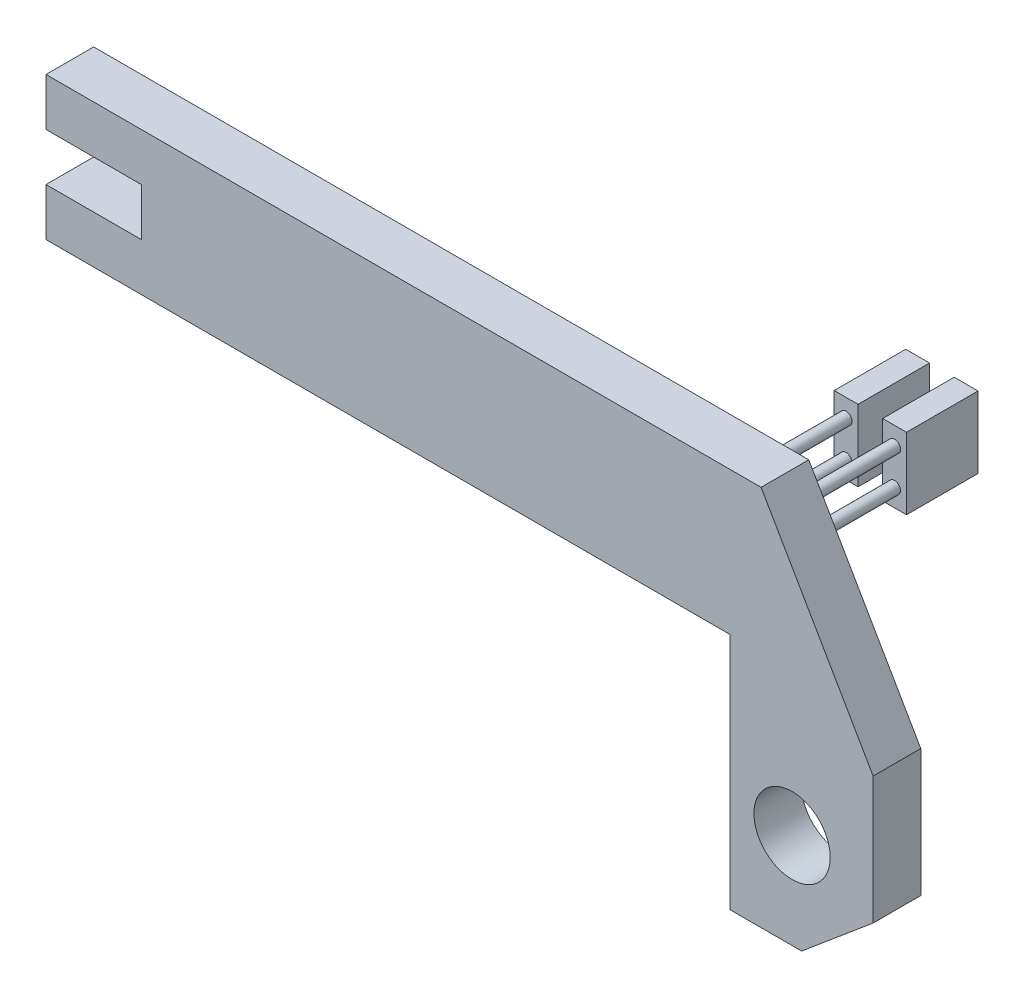
ISO-10303-21;
HEADER;
FILE_DESCRIPTION(('STEP AP214'),'2;1');
FILE_NAME('part.step','',(''),(''),'','','');
FILE_SCHEMA(('AUTOMOTIVE_DESIGN { 1 0 10303 214 1 1 1 1 }'));
ENDSEC;
DATA;
#1=APPLICATION_CONTEXT('core data for automotive mechanical design processes');
#2=APPLICATION_PROTOCOL_DEFINITION('international standard','automotive_design',2000,#1);
#3=PRODUCT_CONTEXT('',#1,'mechanical');
#4=PRODUCT('Part','Part','',(#3));
#5=PRODUCT_RELATED_PRODUCT_CATEGORY('part','',(#4));
#6=PRODUCT_DEFINITION_FORMATION('','',#4);
#7=PRODUCT_DEFINITION_CONTEXT('part definition',#1,'design');
#8=PRODUCT_DEFINITION('design','',#6,#7);
#9=PRODUCT_DEFINITION_SHAPE('','',#8);
#10=(LENGTH_UNIT() NAMED_UNIT(*) SI_UNIT(.MILLI.,.METRE.));
#11=(NAMED_UNIT(*) PLANE_ANGLE_UNIT() SI_UNIT($,.RADIAN.));
#12=(NAMED_UNIT(*) SI_UNIT($,.STERADIAN.) SOLID_ANGLE_UNIT());
#13=UNCERTAINTY_MEASURE_WITH_UNIT(LENGTH_MEASURE(1.E-05),#10,'distance_accuracy_value','');
#14=(GEOMETRIC_REPRESENTATION_CONTEXT(3) GLOBAL_UNCERTAINTY_ASSIGNED_CONTEXT((#13)) GLOBAL_UNIT_ASSIGNED_CONTEXT((#10,
#11,#12)) REPRESENTATION_CONTEXT('',''));
#15=CARTESIAN_POINT('',(0.,0.,0.));
#16=DIRECTION('',(0.,0.,1.));
#17=DIRECTION('',(1.,0.,0.));
#18=AXIS2_PLACEMENT_3D('',#15,#16,#17);
#19=CARTESIAN_POINT('',(0.,0.,0.));
#20=DIRECTION('',(0.,0.,1.));
#21=DIRECTION('',(1.,0.,0.));
#22=AXIS2_PLACEMENT_3D('',#19,#20,#21);
#23=PLANE('',#22);
#24=CARTESIAN_POINT('',(26.0676222127866,1.3,0.));
#25=DIRECTION('',(0.,0.,1.));
#26=DIRECTION('',(1.,0.,0.));
#27=AXIS2_PLACEMENT_3D('',#24,#25,#26);
#28=CIRCLE('',#27,0.25);
#29=CARTESIAN_POINT('',(26.3176222127866,1.3,0.));
#30=VERTEX_POINT('',#29);
#31=EDGE_CURVE('E41',#30,#30,#28,.F.);
#32=ORIENTED_EDGE('',*,*,#31,.F.);
#33=EDGE_LOOP('',(#32));
#34=FACE_BOUND('',#33,.T.);
#35=CARTESIAN_POINT('',(28.1,1.3,0.));
#36=DIRECTION('',(0.,0.,1.));
#37=DIRECTION('',(1.,0.,0.));
#38=AXIS2_PLACEMENT_3D('',#35,#36,#37);
#39=CIRCLE('',#38,0.25);
#40=CARTESIAN_POINT('',(28.35,1.3,0.));
#41=VERTEX_POINT('',#40);
#42=EDGE_CURVE('E209',#41,#41,#39,.F.);
#43=ORIENTED_EDGE('',*,*,#42,.F.);
#44=EDGE_LOOP('',(#43));
#45=FACE_BOUND('',#44,.T.);
#46=DIRECTION('',(0.,-1.,0.));
#47=VECTOR('',#46,1.);
#48=CARTESIAN_POINT('',(0.,2.,0.));
#49=LINE('',#48,#47);
#50=CARTESIAN_POINT('',(0.,2.,0.));
#51=VERTEX_POINT('',#50);
#52=CARTESIAN_POINT('',(0.,0.,0.));
#53=VERTEX_POINT('',#52);
#54=EDGE_CURVE('E159',#51,#53,#49,.T.);
#55=ORIENTED_EDGE('',*,*,#54,.F.);
#56=DIRECTION('',(-1.,0.,0.));
#57=VECTOR('',#56,1.);
#58=CARTESIAN_POINT('',(4.,2.,0.));
#59=LINE('',#58,#57);
#60=CARTESIAN_POINT('',(4.,2.,0.));
#61=VERTEX_POINT('',#60);
#62=EDGE_CURVE('E97',#61,#51,#59,.T.);
#63=ORIENTED_EDGE('',*,*,#62,.F.);
#64=DIRECTION('',(0.,-1.,0.));
#65=VECTOR('',#64,1.);
#66=CARTESIAN_POINT('',(4.,4.,0.));
#67=LINE('',#66,#65);
#68=CARTESIAN_POINT('',(4.,4.,0.));
#69=VERTEX_POINT('',#68);
#70=EDGE_CURVE('E91',#69,#61,#67,.T.);
#71=ORIENTED_EDGE('',*,*,#70,.F.);
#72=DIRECTION('',(1.,0.,0.));
#73=VECTOR('',#72,1.);
#74=CARTESIAN_POINT('',(0.,4.,0.));
#75=LINE('',#74,#73);
#76=CARTESIAN_POINT('',(0.,4.,0.));
#77=VERTEX_POINT('',#76);
#78=EDGE_CURVE('E149',#77,#69,#75,.T.);
#79=ORIENTED_EDGE('',*,*,#78,.F.);
#80=DIRECTION('',(0.,-1.,0.));
#81=VECTOR('',#80,1.);
#82=CARTESIAN_POINT('',(0.,6.,0.));
#83=LINE('',#82,#81);
#84=CARTESIAN_POINT('',(0.,6.,0.));
#85=VERTEX_POINT('',#84);
#86=EDGE_CURVE('E177',#85,#77,#83,.T.);
#87=ORIENTED_EDGE('',*,*,#86,.F.);
#88=DIRECTION('',(-1.,0.,0.));
#89=VECTOR('',#88,1.);
#90=CARTESIAN_POINT('',(30.,6.00000000000001,0.));
#91=LINE('',#90,#89);
#92=CARTESIAN_POINT('',(30.,6.00000000000001,0.));
#93=VERTEX_POINT('',#92);
#94=EDGE_CURVE('E175',#93,#85,#91,.T.);
#95=ORIENTED_EDGE('',*,*,#94,.F.);
#96=DIRECTION('',(-0.5,0.866025403784438,0.));
#97=VECTOR('',#96,1.);
#98=CARTESIAN_POINT('',(34.7,-2.14063879557371,0.));
#99=LINE('',#98,#97);
#100=CARTESIAN_POINT('',(34.7,-2.14063879557371,0.));
#101=VERTEX_POINT('',#100);
#102=EDGE_CURVE('E173',#101,#93,#99,.T.);
#103=ORIENTED_EDGE('',*,*,#102,.F.);
#104=DIRECTION('',(0.,1.,0.));
#105=VECTOR('',#104,1.);
#106=CARTESIAN_POINT('',(34.7,-7.48270110646815,0.));
#107=LINE('',#106,#105);
#108=CARTESIAN_POINT('',(34.7,-7.48270110646815,0.));
#109=VERTEX_POINT('',#108);
#110=EDGE_CURVE('E171',#109,#101,#107,.T.);
#111=ORIENTED_EDGE('',*,*,#110,.F.);
#112=DIRECTION('',(0.766044443118977,0.642787609686541,0.));
#113=VECTOR('',#112,1.);
#114=CARTESIAN_POINT('',(31.7,-10.,0.));
#115=LINE('',#114,#113);
#116=CARTESIAN_POINT('',(31.7,-10.,0.));
#117=VERTEX_POINT('',#116);
#118=EDGE_CURVE('E169',#117,#109,#115,.T.);
#119=ORIENTED_EDGE('',*,*,#118,.F.);
#120=DIRECTION('',(1.,0.,0.));
#121=VECTOR('',#120,1.);
#122=CARTESIAN_POINT('',(28.7,-10.,0.));
#123=LINE('',#122,#121);
#124=CARTESIAN_POINT('',(28.7,-10.,0.));
#125=VERTEX_POINT('',#124);
#126=EDGE_CURVE('E167',#125,#117,#123,.T.);
#127=ORIENTED_EDGE('',*,*,#126,.F.);
#128=DIRECTION('',(0.,-1.,0.));
#129=VECTOR('',#128,1.);
#130=CARTESIAN_POINT('',(28.7,0.,0.));
#131=LINE('',#130,#129);
#132=CARTESIAN_POINT('',(28.7,0.,0.));
#133=VERTEX_POINT('',#132);
#134=EDGE_CURVE('E165',#133,#125,#131,.T.);
#135=ORIENTED_EDGE('',*,*,#134,.F.);
#136=DIRECTION('',(1.,0.,0.));
#137=VECTOR('',#136,1.);
#138=CARTESIAN_POINT('',(0.,0.,0.));
#139=LINE('',#138,#137);
#140=EDGE_CURVE('E162',#53,#133,#139,.T.);
#141=ORIENTED_EDGE('',*,*,#140,.F.);
#142=EDGE_LOOP('',(#55,#63,#71,#79,#87,#95,#103,#111,#119,#127,#135,#141));
#143=FACE_BOUND('',#142,.T.);
#144=CARTESIAN_POINT('',(31.3,-6.,0.));
#145=DIRECTION('',(0.,0.,1.));
#146=DIRECTION('',(1.,0.,0.));
#147=AXIS2_PLACEMENT_3D('',#144,#145,#146);
#148=CIRCLE('',#147,1.6);
#149=CARTESIAN_POINT('',(32.9,-6.,0.));
#150=VERTEX_POINT('',#149);
#151=EDGE_CURVE('E229',#150,#150,#148,.T.);
#152=ORIENTED_EDGE('',*,*,#151,.T.);
#153=EDGE_LOOP('',(#152));
#154=FACE_BOUND('',#153,.T.);
#155=CARTESIAN_POINT('',(28.1,2.8,0.));
#156=DIRECTION('',(0.,0.,1.));
#157=DIRECTION('',(1.,0.,0.));
#158=AXIS2_PLACEMENT_3D('',#155,#156,#157);
#159=CIRCLE('',#158,0.25);
#160=CARTESIAN_POINT('',(28.35,2.8,0.));
#161=VERTEX_POINT('',#160);
#162=EDGE_CURVE('E212',#161,#161,#159,.F.);
#163=ORIENTED_EDGE('',*,*,#162,.F.);
#164=EDGE_LOOP('',(#163));
#165=FACE_BOUND('',#164,.T.);
#166=CARTESIAN_POINT('',(26.0676222127866,2.8,0.));
#167=DIRECTION('',(0.,0.,1.));
#168=DIRECTION('',(1.,0.,0.));
#169=AXIS2_PLACEMENT_3D('',#166,#167,#168);
#170=CIRCLE('',#169,0.25);
#171=CARTESIAN_POINT('',(26.3176222127866,2.8,0.));
#172=VERTEX_POINT('',#171);
#173=EDGE_CURVE('E11',#172,#172,#170,.F.);
#174=ORIENTED_EDGE('',*,*,#173,.F.);
#175=EDGE_LOOP('',(#174));
#176=FACE_BOUND('',#175,.T.);
#177=ADVANCED_FACE('F32',(#34,#45,#143,#154,#165,#176),#23,.F.);
#178=CARTESIAN_POINT('',(0.,0.,2.));
#179=DIRECTION('',(0.,0.,1.));
#180=DIRECTION('',(1.,0.,0.));
#181=AXIS2_PLACEMENT_3D('',#178,#179,#180);
#182=PLANE('',#181);
#183=DIRECTION('',(0.,-1.,0.));
#184=VECTOR('',#183,1.);
#185=CARTESIAN_POINT('',(0.,2.,2.));
#186=LINE('',#185,#184);
#187=CARTESIAN_POINT('',(0.,2.,2.));
#188=VERTEX_POINT('',#187);
#189=CARTESIAN_POINT('',(0.,0.,2.));
#190=VERTEX_POINT('',#189);
#191=EDGE_CURVE('E182',#188,#190,#186,.T.);
#192=ORIENTED_EDGE('',*,*,#191,.T.);
#193=DIRECTION('',(1.,0.,0.));
#194=VECTOR('',#193,1.);
#195=CARTESIAN_POINT('',(0.,0.,2.));
#196=LINE('',#195,#194);
#197=CARTESIAN_POINT('',(28.7,0.,2.));
#198=VERTEX_POINT('',#197);
#199=EDGE_CURVE('E106',#190,#198,#196,.T.);
#200=ORIENTED_EDGE('',*,*,#199,.T.);
#201=DIRECTION('',(0.,-1.,0.));
#202=VECTOR('',#201,1.);
#203=CARTESIAN_POINT('',(28.7,0.,2.));
#204=LINE('',#203,#202);
#205=CARTESIAN_POINT('',(28.7,-10.,2.));
#206=VERTEX_POINT('',#205);
#207=EDGE_CURVE('E310',#198,#206,#204,.T.);
#208=ORIENTED_EDGE('',*,*,#207,.T.);
#209=DIRECTION('',(1.,0.,0.));
#210=VECTOR('',#209,1.);
#211=CARTESIAN_POINT('',(28.7,-10.,2.));
#212=LINE('',#211,#210);
#213=CARTESIAN_POINT('',(31.7,-10.,2.));
#214=VERTEX_POINT('',#213);
#215=EDGE_CURVE('E321',#206,#214,#212,.T.);
#216=ORIENTED_EDGE('',*,*,#215,.T.);
#217=DIRECTION('',(0.766044443118977,0.642787609686541,0.));
#218=VECTOR('',#217,1.);
#219=CARTESIAN_POINT('',(31.7,-10.,2.));
#220=LINE('',#219,#218);
#221=CARTESIAN_POINT('',(34.7,-7.48270110646815,2.));
#222=VERTEX_POINT('',#221);
#223=EDGE_CURVE('E318',#214,#222,#220,.T.);
#224=ORIENTED_EDGE('',*,*,#223,.T.);
#225=DIRECTION('',(0.,1.,0.));
#226=VECTOR('',#225,1.);
#227=CARTESIAN_POINT('',(34.7,-7.48270110646815,2.));
#228=LINE('',#227,#226);
#229=CARTESIAN_POINT('',(34.7,-2.14063879557371,2.));
#230=VERTEX_POINT('',#229);
#231=EDGE_CURVE('E320',#222,#230,#228,.T.);
#232=ORIENTED_EDGE('',*,*,#231,.T.);
#233=DIRECTION('',(-0.5,0.866025403784438,0.));
#234=VECTOR('',#233,1.);
#235=CARTESIAN_POINT('',(34.7,-2.14063879557371,2.));
#236=LINE('',#235,#234);
#237=CARTESIAN_POINT('',(30.,6.00000000000001,2.));
#238=VERTEX_POINT('',#237);
#239=EDGE_CURVE('E323',#230,#238,#236,.T.);
#240=ORIENTED_EDGE('',*,*,#239,.T.);
#241=DIRECTION('',(-1.,0.,0.));
#242=VECTOR('',#241,1.);
#243=CARTESIAN_POINT('',(30.,6.00000000000001,2.));
#244=LINE('',#243,#242);
#245=CARTESIAN_POINT('',(0.,6.,2.));
#246=VERTEX_POINT('',#245);
#247=EDGE_CURVE('E329',#238,#246,#244,.T.);
#248=ORIENTED_EDGE('',*,*,#247,.T.);
#249=DIRECTION('',(0.,-1.,0.));
#250=VECTOR('',#249,1.);
#251=CARTESIAN_POINT('',(0.,6.,2.));
#252=LINE('',#251,#250);
#253=CARTESIAN_POINT('',(0.,4.,2.));
#254=VERTEX_POINT('',#253);
#255=EDGE_CURVE('E141',#246,#254,#252,.T.);
#256=ORIENTED_EDGE('',*,*,#255,.T.);
#257=DIRECTION('',(1.,0.,0.));
#258=VECTOR('',#257,1.);
#259=CARTESIAN_POINT('',(0.,4.,2.));
#260=LINE('',#259,#258);
#261=CARTESIAN_POINT('',(4.,4.,2.));
#262=VERTEX_POINT('',#261);
#263=EDGE_CURVE('E134',#254,#262,#260,.T.);
#264=ORIENTED_EDGE('',*,*,#263,.T.);
#265=DIRECTION('',(0.,-1.,0.));
#266=VECTOR('',#265,1.);
#267=CARTESIAN_POINT('',(4.,4.,2.));
#268=LINE('',#267,#266);
#269=CARTESIAN_POINT('',(4.,2.,2.));
#270=VERTEX_POINT('',#269);
#271=EDGE_CURVE('E139',#262,#270,#268,.T.);
#272=ORIENTED_EDGE('',*,*,#271,.T.);
#273=DIRECTION('',(-1.,0.,0.));
#274=VECTOR('',#273,1.);
#275=CARTESIAN_POINT('',(4.,2.,2.));
#276=LINE('',#275,#274);
#277=EDGE_CURVE('E49',#270,#188,#276,.T.);
#278=ORIENTED_EDGE('',*,*,#277,.T.);
#279=EDGE_LOOP('',(#192,#200,#208,#216,#224,#232,#240,#248,#256,#264,#272,#278));
#280=FACE_BOUND('',#279,.T.);
#281=CARTESIAN_POINT('',(31.3,-6.,2.));
#282=DIRECTION('',(0.,0.,1.));
#283=DIRECTION('',(1.,0.,0.));
#284=AXIS2_PLACEMENT_3D('',#281,#282,#283);
#285=CIRCLE('',#284,1.6);
#286=CARTESIAN_POINT('',(32.9,-6.,2.));
#287=VERTEX_POINT('',#286);
#288=EDGE_CURVE('E163',#287,#287,#285,.T.);
#289=ORIENTED_EDGE('',*,*,#288,.F.);
#290=EDGE_LOOP('',(#289));
#291=FACE_BOUND('',#290,.T.);
#292=ADVANCED_FACE('F136',(#280,#291),#182,.T.);
#293=CARTESIAN_POINT('',(0.,2.,2.));
#294=DIRECTION('',(1.,0.,0.));
#295=DIRECTION('',(0.,1.,0.));
#296=AXIS2_PLACEMENT_3D('',#293,#294,#295);
#297=PLANE('',#296);
#298=ORIENTED_EDGE('',*,*,#54,.T.);
#299=DIRECTION('',(0.,0.,-1.));
#300=VECTOR('',#299,1.);
#301=CARTESIAN_POINT('',(0.,0.,2.));
#302=LINE('',#301,#300);
#303=EDGE_CURVE('E207',#190,#53,#302,.T.);
#304=ORIENTED_EDGE('',*,*,#303,.F.);
#305=ORIENTED_EDGE('',*,*,#191,.F.);
#306=DIRECTION('',(0.,0.,-1.));
#307=VECTOR('',#306,1.);
#308=CARTESIAN_POINT('',(0.,2.,2.));
#309=LINE('',#308,#307);
#310=EDGE_CURVE('E155',#188,#51,#309,.T.);
#311=ORIENTED_EDGE('',*,*,#310,.T.);
#312=EDGE_LOOP('',(#298,#304,#305,#311));
#313=FACE_BOUND('',#312,.T.);
#314=ADVANCED_FACE('F34',(#313),#297,.F.);
#315=CARTESIAN_POINT('',(0.,0.,2.));
#316=DIRECTION('',(0.,1.,0.));
#317=DIRECTION('',(0.,0.,1.));
#318=AXIS2_PLACEMENT_3D('',#315,#316,#317);
#319=PLANE('',#318);
#320=ORIENTED_EDGE('',*,*,#140,.T.);
#321=DIRECTION('',(0.,0.,-1.));
#322=VECTOR('',#321,1.);
#323=CARTESIAN_POINT('',(28.7,0.,2.));
#324=LINE('',#323,#322);
#325=EDGE_CURVE('E204',#198,#133,#324,.T.);
#326=ORIENTED_EDGE('',*,*,#325,.F.);
#327=ORIENTED_EDGE('',*,*,#199,.F.);
#328=ORIENTED_EDGE('',*,*,#303,.T.);
#329=EDGE_LOOP('',(#320,#326,#327,#328));
#330=FACE_BOUND('',#329,.T.);
#331=ADVANCED_FACE('F299',(#330),#319,.F.);
#332=CARTESIAN_POINT('',(28.7,0.,2.));
#333=DIRECTION('',(1.,0.,0.));
#334=DIRECTION('',(0.,0.,-1.));
#335=AXIS2_PLACEMENT_3D('',#332,#333,#334);
#336=PLANE('',#335);
#337=ORIENTED_EDGE('',*,*,#134,.T.);
#338=DIRECTION('',(0.,0.,-1.));
#339=VECTOR('',#338,1.);
#340=CARTESIAN_POINT('',(28.7,-10.,2.));
#341=LINE('',#340,#339);
#342=EDGE_CURVE('E201',#206,#125,#341,.T.);
#343=ORIENTED_EDGE('',*,*,#342,.F.);
#344=ORIENTED_EDGE('',*,*,#207,.F.);
#345=ORIENTED_EDGE('',*,*,#325,.T.);
#346=EDGE_LOOP('',(#337,#343,#344,#345));
#347=FACE_BOUND('',#346,.T.);
#348=ADVANCED_FACE('F296',(#347),#336,.F.);
#349=CARTESIAN_POINT('',(28.7,-10.,2.));
#350=DIRECTION('',(0.,1.,0.));
#351=DIRECTION('',(0.,0.,1.));
#352=AXIS2_PLACEMENT_3D('',#349,#350,#351);
#353=PLANE('',#352);
#354=ORIENTED_EDGE('',*,*,#126,.T.);
#355=DIRECTION('',(0.,0.,-1.));
#356=VECTOR('',#355,1.);
#357=CARTESIAN_POINT('',(31.7,-10.,2.));
#358=LINE('',#357,#356);
#359=EDGE_CURVE('E198',#214,#117,#358,.T.);
#360=ORIENTED_EDGE('',*,*,#359,.F.);
#361=ORIENTED_EDGE('',*,*,#215,.F.);
#362=ORIENTED_EDGE('',*,*,#342,.T.);
#363=EDGE_LOOP('',(#354,#360,#361,#362));
#364=FACE_BOUND('',#363,.T.);
#365=ADVANCED_FACE('F292',(#364),#353,.F.);
#366=CARTESIAN_POINT('',(31.7,-10.,2.));
#367=DIRECTION('',(-0.642787609686541,0.766044443118977,0.));
#368=DIRECTION('',(-0.766044443118977,-0.642787609686541,0.));
#369=AXIS2_PLACEMENT_3D('',#366,#367,#368);
#370=PLANE('',#369);
#371=ORIENTED_EDGE('',*,*,#118,.T.);
#372=DIRECTION('',(0.,0.,-1.));
#373=VECTOR('',#372,1.);
#374=CARTESIAN_POINT('',(34.7,-7.48270110646815,2.));
#375=LINE('',#374,#373);
#376=EDGE_CURVE('E195',#222,#109,#375,.T.);
#377=ORIENTED_EDGE('',*,*,#376,.F.);
#378=ORIENTED_EDGE('',*,*,#223,.F.);
#379=ORIENTED_EDGE('',*,*,#359,.T.);
#380=EDGE_LOOP('',(#371,#377,#378,#379));
#381=FACE_BOUND('',#380,.T.);
#382=ADVANCED_FACE('F288',(#381),#370,.F.);
#383=CARTESIAN_POINT('',(34.7,-7.48270110646815,2.));
#384=DIRECTION('',(-1.,0.,0.));
#385=DIRECTION('',(0.,0.,1.));
#386=AXIS2_PLACEMENT_3D('',#383,#384,#385);
#387=PLANE('',#386);
#388=ORIENTED_EDGE('',*,*,#110,.T.);
#389=DIRECTION('',(0.,0.,-1.));
#390=VECTOR('',#389,1.);
#391=CARTESIAN_POINT('',(34.7,-2.14063879557371,2.));
#392=LINE('',#391,#390);
#393=EDGE_CURVE('E192',#230,#101,#392,.T.);
#394=ORIENTED_EDGE('',*,*,#393,.F.);
#395=ORIENTED_EDGE('',*,*,#231,.F.);
#396=ORIENTED_EDGE('',*,*,#376,.T.);
#397=EDGE_LOOP('',(#388,#394,#395,#396));
#398=FACE_BOUND('',#397,.T.);
#399=ADVANCED_FACE('F284',(#398),#387,.F.);
#400=CARTESIAN_POINT('',(34.7,-2.14063879557371,2.));
#401=DIRECTION('',(-0.866025403784438,-0.5,0.));
#402=DIRECTION('',(0.5,-0.866025403784438,0.));
#403=AXIS2_PLACEMENT_3D('',#400,#401,#402);
#404=PLANE('',#403);
#405=ORIENTED_EDGE('',*,*,#102,.T.);
#406=DIRECTION('',(0.,0.,-1.));
#407=VECTOR('',#406,1.);
#408=CARTESIAN_POINT('',(30.,6.00000000000001,2.));
#409=LINE('',#408,#407);
#410=EDGE_CURVE('E189',#238,#93,#409,.T.);
#411=ORIENTED_EDGE('',*,*,#410,.F.);
#412=ORIENTED_EDGE('',*,*,#239,.F.);
#413=ORIENTED_EDGE('',*,*,#393,.T.);
#414=EDGE_LOOP('',(#405,#411,#412,#413));
#415=FACE_BOUND('',#414,.T.);
#416=ADVANCED_FACE('F280',(#415),#404,.F.);
#417=CARTESIAN_POINT('',(30.,6.00000000000001,2.));
#418=DIRECTION('',(0.,-1.,0.));
#419=DIRECTION('',(1.,0.,0.));
#420=AXIS2_PLACEMENT_3D('',#417,#418,#419);
#421=PLANE('',#420);
#422=ORIENTED_EDGE('',*,*,#94,.T.);
#423=DIRECTION('',(0.,0.,-1.));
#424=VECTOR('',#423,1.);
#425=CARTESIAN_POINT('',(0.,6.,2.));
#426=LINE('',#425,#424);
#427=EDGE_CURVE('E186',#246,#85,#426,.T.);
#428=ORIENTED_EDGE('',*,*,#427,.F.);
#429=ORIENTED_EDGE('',*,*,#247,.F.);
#430=ORIENTED_EDGE('',*,*,#410,.T.);
#431=EDGE_LOOP('',(#422,#428,#429,#430));
#432=FACE_BOUND('',#431,.T.);
#433=ADVANCED_FACE('F276',(#432),#421,.F.);
#434=CARTESIAN_POINT('',(0.,6.,2.));
#435=DIRECTION('',(1.,0.,0.));
#436=DIRECTION('',(0.,1.,0.));
#437=AXIS2_PLACEMENT_3D('',#434,#435,#436);
#438=PLANE('',#437);
#439=ORIENTED_EDGE('',*,*,#86,.T.);
#440=DIRECTION('',(0.,0.,-1.));
#441=VECTOR('',#440,1.);
#442=CARTESIAN_POINT('',(0.,4.,2.));
#443=LINE('',#442,#441);
#444=EDGE_CURVE('E150',#254,#77,#443,.T.);
#445=ORIENTED_EDGE('',*,*,#444,.F.);
#446=ORIENTED_EDGE('',*,*,#255,.F.);
#447=ORIENTED_EDGE('',*,*,#427,.T.);
#448=EDGE_LOOP('',(#439,#445,#446,#447));
#449=FACE_BOUND('',#448,.T.);
#450=ADVANCED_FACE('F273',(#449),#438,.F.);
#451=CARTESIAN_POINT('',(0.,4.,2.));
#452=DIRECTION('',(0.,1.,0.));
#453=DIRECTION('',(0.,0.,1.));
#454=AXIS2_PLACEMENT_3D('',#451,#452,#453);
#455=PLANE('',#454);
#456=ORIENTED_EDGE('',*,*,#78,.T.);
#457=DIRECTION('',(0.,0.,-1.));
#458=VECTOR('',#457,1.);
#459=CARTESIAN_POINT('',(4.,4.,2.));
#460=LINE('',#459,#458);
#461=EDGE_CURVE('E146',#262,#69,#460,.T.);
#462=ORIENTED_EDGE('',*,*,#461,.F.);
#463=ORIENTED_EDGE('',*,*,#263,.F.);
#464=ORIENTED_EDGE('',*,*,#444,.T.);
#465=EDGE_LOOP('',(#456,#462,#463,#464));
#466=FACE_BOUND('',#465,.T.);
#467=ADVANCED_FACE('F147',(#466),#455,.F.);
#468=CARTESIAN_POINT('',(4.,4.,2.));
#469=DIRECTION('',(1.,0.,0.));
#470=DIRECTION('',(0.,1.,0.));
#471=AXIS2_PLACEMENT_3D('',#468,#469,#470);
#472=PLANE('',#471);
#473=ORIENTED_EDGE('',*,*,#70,.T.);
#474=DIRECTION('',(0.,0.,-1.));
#475=VECTOR('',#474,1.);
#476=CARTESIAN_POINT('',(4.,2.,2.));
#477=LINE('',#476,#475);
#478=EDGE_CURVE('E151',#270,#61,#477,.T.);
#479=ORIENTED_EDGE('',*,*,#478,.F.);
#480=ORIENTED_EDGE('',*,*,#271,.F.);
#481=ORIENTED_EDGE('',*,*,#461,.T.);
#482=EDGE_LOOP('',(#473,#479,#480,#481));
#483=FACE_BOUND('',#482,.T.);
#484=ADVANCED_FACE('F153',(#483),#472,.F.);
#485=CARTESIAN_POINT('',(4.,2.,2.));
#486=DIRECTION('',(0.,-1.,0.));
#487=DIRECTION('',(0.,0.,-1.));
#488=AXIS2_PLACEMENT_3D('',#485,#486,#487);
#489=PLANE('',#488);
#490=ORIENTED_EDGE('',*,*,#62,.T.);
#491=ORIENTED_EDGE('',*,*,#310,.F.);
#492=ORIENTED_EDGE('',*,*,#277,.F.);
#493=ORIENTED_EDGE('',*,*,#478,.T.);
#494=EDGE_LOOP('',(#490,#491,#492,#493));
#495=FACE_BOUND('',#494,.T.);
#496=ADVANCED_FACE('F263',(#495),#489,.F.);
#497=CARTESIAN_POINT('',(31.3,-6.,2.));
#498=DIRECTION('',(0.,0.,-1.));
#499=DIRECTION('',(-1.,0.,0.));
#500=AXIS2_PLACEMENT_3D('',#497,#498,#499);
#501=CYLINDRICAL_SURFACE('',#500,1.6);
#502=ORIENTED_EDGE('',*,*,#288,.T.);
#503=EDGE_LOOP('',(#502));
#504=FACE_BOUND('',#503,.T.);
#505=ORIENTED_EDGE('',*,*,#151,.F.);
#506=EDGE_LOOP('',(#505));
#507=FACE_BOUND('',#506,.T.);
#508=ADVANCED_FACE('F259',(#504,#507),#501,.F.);
#509=CARTESIAN_POINT('',(28.1,1.3,-5.5));
#510=DIRECTION('',(0.,0.,1.));
#511=DIRECTION('',(1.,0.,0.));
#512=AXIS2_PLACEMENT_3D('',#509,#510,#511);
#513=CYLINDRICAL_SURFACE('',#512,0.25);
#514=CARTESIAN_POINT('',(28.1,1.3,-5.5));
#515=DIRECTION('',(0.,0.,-1.));
#516=DIRECTION('',(-1.,0.,0.));
#517=AXIS2_PLACEMENT_3D('',#514,#515,#516);
#518=CIRCLE('',#517,0.25);
#519=CARTESIAN_POINT('',(27.85,1.3,-5.5));
#520=VERTEX_POINT('',#519);
#521=EDGE_CURVE('E342',#520,#520,#518,.T.);
#522=ORIENTED_EDGE('',*,*,#521,.F.);
#523=EDGE_LOOP('',(#522));
#524=FACE_BOUND('',#523,.T.);
#525=ORIENTED_EDGE('',*,*,#42,.T.);
#526=EDGE_LOOP('',(#525));
#527=FACE_BOUND('',#526,.T.);
#528=ADVANCED_FACE('F255',(#524,#527),#513,.T.);
#529=CARTESIAN_POINT('',(28.1,2.8,-5.5));
#530=DIRECTION('',(0.,0.,1.));
#531=DIRECTION('',(1.,0.,0.));
#532=AXIS2_PLACEMENT_3D('',#529,#530,#531);
#533=CYLINDRICAL_SURFACE('',#532,0.25);
#534=CARTESIAN_POINT('',(28.1,2.8,-5.5));
#535=DIRECTION('',(0.,0.,-1.));
#536=DIRECTION('',(-1.,0.,0.));
#537=AXIS2_PLACEMENT_3D('',#534,#535,#536);
#538=CIRCLE('',#537,0.25);
#539=CARTESIAN_POINT('',(27.85,2.8,-5.5));
#540=VERTEX_POINT('',#539);
#541=EDGE_CURVE('E347',#540,#540,#538,.T.);
#542=ORIENTED_EDGE('',*,*,#541,.F.);
#543=EDGE_LOOP('',(#542));
#544=FACE_BOUND('',#543,.T.);
#545=ORIENTED_EDGE('',*,*,#162,.T.);
#546=EDGE_LOOP('',(#545));
#547=FACE_BOUND('',#546,.T.);
#548=ADVANCED_FACE('F246',(#544,#547),#533,.T.);
#549=CARTESIAN_POINT('',(26.0676222127866,1.3,-5.5));
#550=DIRECTION('',(0.,0.,1.));
#551=DIRECTION('',(1.,0.,0.));
#552=AXIS2_PLACEMENT_3D('',#549,#550,#551);
#553=CYLINDRICAL_SURFACE('',#552,0.25);
#554=CARTESIAN_POINT('',(26.0676222127866,1.3,-5.5));
#555=DIRECTION('',(0.,0.,-1.));
#556=DIRECTION('',(-1.,0.,0.));
#557=AXIS2_PLACEMENT_3D('',#554,#555,#556);
#558=CIRCLE('',#557,0.25);
#559=CARTESIAN_POINT('',(25.8176222127866,1.3,-5.5));
#560=VERTEX_POINT('',#559);
#561=EDGE_CURVE('E350',#560,#560,#558,.T.);
#562=ORIENTED_EDGE('',*,*,#561,.F.);
#563=EDGE_LOOP('',(#562));
#564=FACE_BOUND('',#563,.T.);
#565=ORIENTED_EDGE('',*,*,#31,.T.);
#566=EDGE_LOOP('',(#565));
#567=FACE_BOUND('',#566,.T.);
#568=ADVANCED_FACE('F217',(#564,#567),#553,.T.);
#569=CARTESIAN_POINT('',(26.0676222127866,2.8,-5.5));
#570=DIRECTION('',(0.,0.,1.));
#571=DIRECTION('',(1.,0.,0.));
#572=AXIS2_PLACEMENT_3D('',#569,#570,#571);
#573=CYLINDRICAL_SURFACE('',#572,0.25);
#574=CARTESIAN_POINT('',(26.0676222127866,2.8,-5.5));
#575=DIRECTION('',(0.,0.,-1.));
#576=DIRECTION('',(-1.,0.,0.));
#577=AXIS2_PLACEMENT_3D('',#574,#575,#576);
#578=CIRCLE('',#577,0.25);
#579=CARTESIAN_POINT('',(25.8176222127866,2.8,-5.5));
#580=VERTEX_POINT('',#579);
#581=EDGE_CURVE('E353',#580,#580,#578,.T.);
#582=ORIENTED_EDGE('',*,*,#581,.F.);
#583=EDGE_LOOP('',(#582));
#584=FACE_BOUND('',#583,.T.);
#585=ORIENTED_EDGE('',*,*,#173,.T.);
#586=EDGE_LOOP('',(#585));
#587=FACE_BOUND('',#586,.T.);
#588=ADVANCED_FACE('F234',(#584,#587),#573,.T.);
#589=CARTESIAN_POINT('',(27.6,0.55,-5.5));
#590=DIRECTION('',(0.,0.,1.));
#591=DIRECTION('',(1.,0.,0.));
#592=AXIS2_PLACEMENT_3D('',#589,#590,#591);
#593=PLANE('',#592);
#594=ORIENTED_EDGE('',*,*,#541,.T.);
#595=EDGE_LOOP('',(#594));
#596=FACE_BOUND('',#595,.T.);
#597=DIRECTION('',(0.,1.,0.));
#598=VECTOR('',#597,1.);
#599=CARTESIAN_POINT('',(27.6,3.55,-5.5));
#600=LINE('',#599,#598);
#601=CARTESIAN_POINT('',(27.6,0.55,-5.5));
#602=VERTEX_POINT('',#601);
#603=CARTESIAN_POINT('',(27.6,3.55,-5.5));
#604=VERTEX_POINT('',#603);
#605=EDGE_CURVE('E379',#602,#604,#600,.T.);
#606=ORIENTED_EDGE('',*,*,#605,.F.);
#607=DIRECTION('',(-1.,0.,0.));
#608=VECTOR('',#607,1.);
#609=CARTESIAN_POINT('',(27.6,0.55,-5.5));
#610=LINE('',#609,#608);
#611=CARTESIAN_POINT('',(28.6,0.55,-5.5));
#612=VERTEX_POINT('',#611);
#613=EDGE_CURVE('E369',#612,#602,#610,.T.);
#614=ORIENTED_EDGE('',*,*,#613,.F.);
#615=DIRECTION('',(0.,-1.,0.));
#616=VECTOR('',#615,1.);
#617=CARTESIAN_POINT('',(28.6,3.55,-5.5));
#618=LINE('',#617,#616);
#619=CARTESIAN_POINT('',(28.6,3.55,-5.5));
#620=VERTEX_POINT('',#619);
#621=EDGE_CURVE('E373',#620,#612,#618,.T.);
#622=ORIENTED_EDGE('',*,*,#621,.F.);
#623=DIRECTION('',(1.,0.,0.));
#624=VECTOR('',#623,1.);
#625=CARTESIAN_POINT('',(27.6,3.55,-5.5));
#626=LINE('',#625,#624);
#627=EDGE_CURVE('E376',#604,#620,#626,.T.);
#628=ORIENTED_EDGE('',*,*,#627,.F.);
#629=EDGE_LOOP('',(#606,#614,#622,#628));
#630=FACE_BOUND('',#629,.T.);
#631=ORIENTED_EDGE('',*,*,#521,.T.);
#632=EDGE_LOOP('',(#631));
#633=FACE_BOUND('',#632,.T.);
#634=ADVANCED_FACE('F236',(#596,#630,#633),#593,.T.);
#635=CARTESIAN_POINT('',(27.6,3.55,-8.5));
#636=DIRECTION('',(1.,0.,0.));
#637=DIRECTION('',(0.,0.,-1.));
#638=AXIS2_PLACEMENT_3D('',#635,#636,#637);
#639=PLANE('',#638);
#640=ORIENTED_EDGE('',*,*,#605,.T.);
#641=DIRECTION('',(0.,0.,1.));
#642=VECTOR('',#641,1.);
#643=CARTESIAN_POINT('',(27.6,3.55,-8.5));
#644=LINE('',#643,#642);
#645=CARTESIAN_POINT('',(27.6,3.55,-8.5));
#646=VERTEX_POINT('',#645);
#647=EDGE_CURVE('E356',#646,#604,#644,.T.);
#648=ORIENTED_EDGE('',*,*,#647,.F.);
#649=DIRECTION('',(0.,1.,0.));
#650=VECTOR('',#649,1.);
#651=CARTESIAN_POINT('',(27.6,3.55,-8.5));
#652=LINE('',#651,#650);
#653=CARTESIAN_POINT('',(27.6,0.55,-8.5));
#654=VERTEX_POINT('',#653);
#655=EDGE_CURVE('E372',#654,#646,#652,.T.);
#656=ORIENTED_EDGE('',*,*,#655,.F.);
#657=DIRECTION('',(0.,0.,1.));
#658=VECTOR('',#657,1.);
#659=CARTESIAN_POINT('',(27.6,0.55,-8.5));
#660=LINE('',#659,#658);
#661=EDGE_CURVE('E365',#654,#602,#660,.T.);
#662=ORIENTED_EDGE('',*,*,#661,.T.);
#663=EDGE_LOOP('',(#640,#648,#656,#662));
#664=FACE_BOUND('',#663,.T.);
#665=ADVANCED_FACE('F243',(#664),#639,.F.);
#666=CARTESIAN_POINT('',(27.6,3.55,-8.5));
#667=DIRECTION('',(0.,-1.,0.));
#668=DIRECTION('',(1.,0.,0.));
#669=AXIS2_PLACEMENT_3D('',#666,#667,#668);
#670=PLANE('',#669);
#671=ORIENTED_EDGE('',*,*,#627,.T.);
#672=DIRECTION('',(0.,0.,1.));
#673=VECTOR('',#672,1.);
#674=CARTESIAN_POINT('',(28.6,3.55,-8.5));
#675=LINE('',#674,#673);
#676=CARTESIAN_POINT('',(28.6,3.55,-8.5));
#677=VERTEX_POINT('',#676);
#678=EDGE_CURVE('E359',#677,#620,#675,.T.);
#679=ORIENTED_EDGE('',*,*,#678,.F.);
#680=DIRECTION('',(1.,0.,0.));
#681=VECTOR('',#680,1.);
#682=CARTESIAN_POINT('',(27.6,3.55,-8.5));
#683=LINE('',#682,#681);
#684=EDGE_CURVE('E388',#646,#677,#683,.T.);
#685=ORIENTED_EDGE('',*,*,#684,.F.);
#686=ORIENTED_EDGE('',*,*,#647,.T.);
#687=EDGE_LOOP('',(#671,#679,#685,#686));
#688=FACE_BOUND('',#687,.T.);
#689=ADVANCED_FACE('F487',(#688),#670,.F.);
#690=CARTESIAN_POINT('',(28.6,3.55,-8.5));
#691=DIRECTION('',(-1.,0.,0.));
#692=DIRECTION('',(0.,0.,1.));
#693=AXIS2_PLACEMENT_3D('',#690,#691,#692);
#694=PLANE('',#693);
#695=ORIENTED_EDGE('',*,*,#621,.T.);
#696=DIRECTION('',(0.,0.,1.));
#697=VECTOR('',#696,1.);
#698=CARTESIAN_POINT('',(28.6,0.55,-8.5));
#699=LINE('',#698,#697);
#700=CARTESIAN_POINT('',(28.6,0.55,-8.5));
#701=VERTEX_POINT('',#700);
#702=EDGE_CURVE('E362',#701,#612,#699,.T.);
#703=ORIENTED_EDGE('',*,*,#702,.F.);
#704=DIRECTION('',(0.,-1.,0.));
#705=VECTOR('',#704,1.);
#706=CARTESIAN_POINT('',(28.6,3.55,-8.5));
#707=LINE('',#706,#705);
#708=EDGE_CURVE('E385',#677,#701,#707,.T.);
#709=ORIENTED_EDGE('',*,*,#708,.F.);
#710=ORIENTED_EDGE('',*,*,#678,.T.);
#711=EDGE_LOOP('',(#695,#703,#709,#710));
#712=FACE_BOUND('',#711,.T.);
#713=ADVANCED_FACE('F491',(#712),#694,.F.);
#714=CARTESIAN_POINT('',(27.6,0.55,-8.5));
#715=DIRECTION('',(0.,1.,0.));
#716=DIRECTION('',(-1.,0.,0.));
#717=AXIS2_PLACEMENT_3D('',#714,#715,#716);
#718=PLANE('',#717);
#719=ORIENTED_EDGE('',*,*,#613,.T.);
#720=ORIENTED_EDGE('',*,*,#661,.F.);
#721=DIRECTION('',(-1.,0.,0.));
#722=VECTOR('',#721,1.);
#723=CARTESIAN_POINT('',(27.6,0.55,-8.5));
#724=LINE('',#723,#722);
#725=EDGE_CURVE('E368',#701,#654,#724,.T.);
#726=ORIENTED_EDGE('',*,*,#725,.F.);
#727=ORIENTED_EDGE('',*,*,#702,.T.);
#728=EDGE_LOOP('',(#719,#720,#726,#727));
#729=FACE_BOUND('',#728,.T.);
#730=ADVANCED_FACE('F477',(#729),#718,.F.);
#731=CARTESIAN_POINT('',(27.6,0.55,-8.5));
#732=DIRECTION('',(0.,0.,1.));
#733=DIRECTION('',(1.,0.,0.));
#734=AXIS2_PLACEMENT_3D('',#731,#732,#733);
#735=PLANE('',#734);
#736=ORIENTED_EDGE('',*,*,#655,.T.);
#737=ORIENTED_EDGE('',*,*,#684,.T.);
#738=ORIENTED_EDGE('',*,*,#708,.T.);
#739=ORIENTED_EDGE('',*,*,#725,.T.);
#740=EDGE_LOOP('',(#736,#737,#738,#739));
#741=FACE_BOUND('',#740,.T.);
#742=ADVANCED_FACE('F490',(#741),#735,.F.);
#743=CARTESIAN_POINT('',(25.5676222127866,3.55,-5.5));
#744=DIRECTION('',(0.,0.,-1.));
#745=DIRECTION('',(-1.,0.,0.));
#746=AXIS2_PLACEMENT_3D('',#743,#744,#745);
#747=PLANE('',#746);
#748=ORIENTED_EDGE('',*,*,#581,.T.);
#749=EDGE_LOOP('',(#748));
#750=FACE_BOUND('',#749,.T.);
#751=DIRECTION('',(0.,1.,0.));
#752=VECTOR('',#751,1.);
#753=CARTESIAN_POINT('',(25.5676222127866,0.55,-5.5));
#754=LINE('',#753,#752);
#755=CARTESIAN_POINT('',(25.5676222127866,0.55,-5.5));
#756=VERTEX_POINT('',#755);
#757=CARTESIAN_POINT('',(25.5676222127866,3.55,-5.5));
#758=VERTEX_POINT('',#757);
#759=EDGE_CURVE('E415',#756,#758,#754,.T.);
#760=ORIENTED_EDGE('',*,*,#759,.F.);
#761=DIRECTION('',(-1.,0.,0.));
#762=VECTOR('',#761,1.);
#763=CARTESIAN_POINT('',(25.5676222127866,0.55,-5.5));
#764=LINE('',#763,#762);
#765=CARTESIAN_POINT('',(26.5676222127866,0.549999999999999,-5.5));
#766=VERTEX_POINT('',#765);
#767=EDGE_CURVE('E405',#766,#756,#764,.T.);
#768=ORIENTED_EDGE('',*,*,#767,.F.);
#769=DIRECTION('',(0.,-1.,0.));
#770=VECTOR('',#769,1.);
#771=CARTESIAN_POINT('',(26.5676222127866,0.549999999999999,-5.5));
#772=LINE('',#771,#770);
#773=CARTESIAN_POINT('',(26.5676222127866,3.55,-5.5));
#774=VERTEX_POINT('',#773);
#775=EDGE_CURVE('E409',#774,#766,#772,.T.);
#776=ORIENTED_EDGE('',*,*,#775,.F.);
#777=DIRECTION('',(1.,0.,0.));
#778=VECTOR('',#777,1.);
#779=CARTESIAN_POINT('',(25.5676222127866,3.55,-5.5));
#780=LINE('',#779,#778);
#781=EDGE_CURVE('E412',#758,#774,#780,.T.);
#782=ORIENTED_EDGE('',*,*,#781,.F.);
#783=EDGE_LOOP('',(#760,#768,#776,#782));
#784=FACE_BOUND('',#783,.T.);
#785=ORIENTED_EDGE('',*,*,#561,.T.);
#786=EDGE_LOOP('',(#785));
#787=FACE_BOUND('',#786,.T.);
#788=ADVANCED_FACE('F502',(#750,#784,#787),#747,.F.);
#789=CARTESIAN_POINT('',(25.5676222127866,0.55,-8.5));
#790=DIRECTION('',(1.,0.,0.));
#791=DIRECTION('',(0.,0.,-1.));
#792=AXIS2_PLACEMENT_3D('',#789,#790,#791);
#793=PLANE('',#792);
#794=ORIENTED_EDGE('',*,*,#759,.T.);
#795=DIRECTION('',(0.,0.,1.));
#796=VECTOR('',#795,1.);
#797=CARTESIAN_POINT('',(25.5676222127866,3.55,-8.5));
#798=LINE('',#797,#796);
#799=CARTESIAN_POINT('',(25.5676222127866,3.55,-8.5));
#800=VERTEX_POINT('',#799);
#801=EDGE_CURVE('E382',#800,#758,#798,.T.);
#802=ORIENTED_EDGE('',*,*,#801,.F.);
#803=DIRECTION('',(0.,1.,0.));
#804=VECTOR('',#803,1.);
#805=CARTESIAN_POINT('',(25.5676222127866,0.55,-8.5));
#806=LINE('',#805,#804);
#807=CARTESIAN_POINT('',(25.5676222127866,0.55,-8.5));
#808=VERTEX_POINT('',#807);
#809=EDGE_CURVE('E408',#808,#800,#806,.T.);
#810=ORIENTED_EDGE('',*,*,#809,.F.);
#811=DIRECTION('',(0.,0.,1.));
#812=VECTOR('',#811,1.);
#813=CARTESIAN_POINT('',(25.5676222127866,0.55,-8.5));
#814=LINE('',#813,#812);
#815=EDGE_CURVE('E401',#808,#756,#814,.T.);
#816=ORIENTED_EDGE('',*,*,#815,.T.);
#817=EDGE_LOOP('',(#794,#802,#810,#816));
#818=FACE_BOUND('',#817,.T.);
#819=ADVANCED_FACE('F441',(#818),#793,.F.);
#820=CARTESIAN_POINT('',(25.5676222127866,3.55,-8.5));
#821=DIRECTION('',(0.,-1.,0.));
#822=DIRECTION('',(1.,0.,0.));
#823=AXIS2_PLACEMENT_3D('',#820,#821,#822);
#824=PLANE('',#823);
#825=ORIENTED_EDGE('',*,*,#781,.T.);
#826=DIRECTION('',(0.,0.,1.));
#827=VECTOR('',#826,1.);
#828=CARTESIAN_POINT('',(26.5676222127866,3.55,-8.5));
#829=LINE('',#828,#827);
#830=CARTESIAN_POINT('',(26.5676222127866,3.55,-8.5));
#831=VERTEX_POINT('',#830);
#832=EDGE_CURVE('E395',#831,#774,#829,.T.);
#833=ORIENTED_EDGE('',*,*,#832,.F.);
#834=DIRECTION('',(1.,0.,0.));
#835=VECTOR('',#834,1.);
#836=CARTESIAN_POINT('',(25.5676222127866,3.55,-8.5));
#837=LINE('',#836,#835);
#838=EDGE_CURVE('E423',#800,#831,#837,.T.);
#839=ORIENTED_EDGE('',*,*,#838,.F.);
#840=ORIENTED_EDGE('',*,*,#801,.T.);
#841=EDGE_LOOP('',(#825,#833,#839,#840));
#842=FACE_BOUND('',#841,.T.);
#843=ADVANCED_FACE('F445',(#842),#824,.F.);
#844=CARTESIAN_POINT('',(26.5676222127866,0.549999999999999,-8.5));
#845=DIRECTION('',(-1.,0.,0.));
#846=DIRECTION('',(0.,0.,1.));
#847=AXIS2_PLACEMENT_3D('',#844,#845,#846);
#848=PLANE('',#847);
#849=ORIENTED_EDGE('',*,*,#775,.T.);
#850=DIRECTION('',(0.,0.,1.));
#851=VECTOR('',#850,1.);
#852=CARTESIAN_POINT('',(26.5676222127866,0.549999999999999,-8.5));
#853=LINE('',#852,#851);
#854=CARTESIAN_POINT('',(26.5676222127866,0.549999999999999,-8.5));
#855=VERTEX_POINT('',#854);
#856=EDGE_CURVE('E398',#855,#766,#853,.T.);
#857=ORIENTED_EDGE('',*,*,#856,.F.);
#858=DIRECTION('',(0.,-1.,0.));
#859=VECTOR('',#858,1.);
#860=CARTESIAN_POINT('',(26.5676222127866,0.549999999999999,-8.5));
#861=LINE('',#860,#859);
#862=EDGE_CURVE('E420',#831,#855,#861,.T.);
#863=ORIENTED_EDGE('',*,*,#862,.F.);
#864=ORIENTED_EDGE('',*,*,#832,.T.);
#865=EDGE_LOOP('',(#849,#857,#863,#864));
#866=FACE_BOUND('',#865,.T.);
#867=ADVANCED_FACE('F507',(#866),#848,.F.);
#868=CARTESIAN_POINT('',(25.5676222127866,0.55,-8.5));
#869=DIRECTION('',(0.,1.,0.));
#870=DIRECTION('',(-1.,0.,0.));
#871=AXIS2_PLACEMENT_3D('',#868,#869,#870);
#872=PLANE('',#871);
#873=ORIENTED_EDGE('',*,*,#767,.T.);
#874=ORIENTED_EDGE('',*,*,#815,.F.);
#875=DIRECTION('',(-1.,0.,0.));
#876=VECTOR('',#875,1.);
#877=CARTESIAN_POINT('',(25.5676222127866,0.55,-8.5));
#878=LINE('',#877,#876);
#879=EDGE_CURVE('E404',#855,#808,#878,.T.);
#880=ORIENTED_EDGE('',*,*,#879,.F.);
#881=ORIENTED_EDGE('',*,*,#856,.T.);
#882=EDGE_LOOP('',(#873,#874,#880,#881));
#883=FACE_BOUND('',#882,.T.);
#884=ADVANCED_FACE('F510',(#883),#872,.F.);
#885=CARTESIAN_POINT('',(25.5676222127866,3.55,-8.5));
#886=DIRECTION('',(0.,0.,-1.));
#887=DIRECTION('',(-1.,0.,0.));
#888=AXIS2_PLACEMENT_3D('',#885,#886,#887);
#889=PLANE('',#888);
#890=ORIENTED_EDGE('',*,*,#809,.T.);
#891=ORIENTED_EDGE('',*,*,#838,.T.);
#892=ORIENTED_EDGE('',*,*,#862,.T.);
#893=ORIENTED_EDGE('',*,*,#879,.T.);
#894=EDGE_LOOP('',(#890,#891,#892,#893));
#895=FACE_BOUND('',#894,.T.);
#896=ADVANCED_FACE('F431',(#895),#889,.T.);
#897=CLOSED_SHELL('',(#177,#292,#314,#331,#348,#365,#382,#399,#416,#433,#450,#467,#484,#496,
#508,#528,#548,#568,#588,#634,#665,#689,#713,#730,#742,#788,#819,#843,#867,#884,#896));
#898=MANIFOLD_SOLID_BREP('B2',#897);
#899=ADVANCED_BREP_SHAPE_REPRESENTATION('',(#18,#898),#14);
#900=SHAPE_DEFINITION_REPRESENTATION(#9,#899);
ENDSEC;
END-ISO-10303-21;
